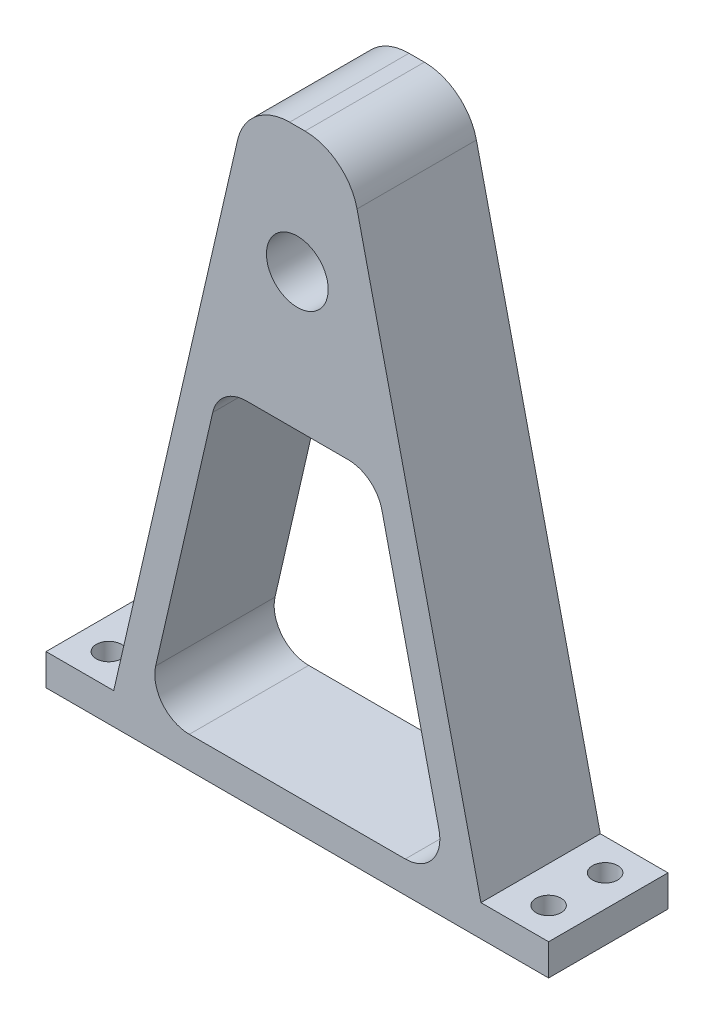
ISO-10303-21;
HEADER;
FILE_DESCRIPTION(('STEP AP214'),'2;1');
FILE_NAME('part.step','',(''),(''),'','','');
FILE_SCHEMA(('AUTOMOTIVE_DESIGN { 1 0 10303 214 1 1 1 1 }'));
ENDSEC;
DATA;
#1=APPLICATION_CONTEXT('core data for automotive mechanical design processes');
#2=APPLICATION_PROTOCOL_DEFINITION('international standard','automotive_design',2000,#1);
#3=PRODUCT_CONTEXT('',#1,'mechanical');
#4=PRODUCT('Part','Part','',(#3));
#5=PRODUCT_RELATED_PRODUCT_CATEGORY('part','',(#4));
#6=PRODUCT_DEFINITION_FORMATION('','',#4);
#7=PRODUCT_DEFINITION_CONTEXT('part definition',#1,'design');
#8=PRODUCT_DEFINITION('design','',#6,#7);
#9=PRODUCT_DEFINITION_SHAPE('','',#8);
#10=(LENGTH_UNIT() NAMED_UNIT(*) SI_UNIT(.MILLI.,.METRE.));
#11=(NAMED_UNIT(*) PLANE_ANGLE_UNIT() SI_UNIT($,.RADIAN.));
#12=(NAMED_UNIT(*) SI_UNIT($,.STERADIAN.) SOLID_ANGLE_UNIT());
#13=UNCERTAINTY_MEASURE_WITH_UNIT(LENGTH_MEASURE(1.E-05),#10,'distance_accuracy_value','');
#14=(GEOMETRIC_REPRESENTATION_CONTEXT(3) GLOBAL_UNCERTAINTY_ASSIGNED_CONTEXT((#13)) GLOBAL_UNIT_ASSIGNED_CONTEXT((#10,
#11,#12)) REPRESENTATION_CONTEXT('',''));
#15=CARTESIAN_POINT('',(0.,0.,0.));
#16=DIRECTION('',(0.,0.,1.));
#17=DIRECTION('',(1.,0.,0.));
#18=AXIS2_PLACEMENT_3D('',#15,#16,#17);
#19=CARTESIAN_POINT('',(0.,0.,-7.));
#20=DIRECTION('',(0.,0.,1.));
#21=DIRECTION('',(1.,0.,0.));
#22=AXIS2_PLACEMENT_3D('',#19,#20,#21);
#23=PLANE('',#22);
#24=DIRECTION('',(-0.224062946507409,-0.974574674410544,0.));
#25=VECTOR('',#24,1.);
#26=CARTESIAN_POINT('',(-17.9334567496,4.12305312859572,-7.));
#27=LINE('',#26,#25);
#28=CARTESIAN_POINT('',(-9.50819876408622,40.7691973753215,-7.));
#29=VERTEX_POINT('',#28);
#30=CARTESIAN_POINT('',(-29.2272614363371,-45.,-7.));
#31=VERTEX_POINT('',#30);
#32=EDGE_CURVE('E225',#29,#31,#27,.T.);
#33=ORIENTED_EDGE('',*,*,#32,.F.);
#34=CARTESIAN_POINT('',(-1.2243140315966,38.8646623300085,-7.));
#35=DIRECTION('',(0.,0.,1.));
#36=DIRECTION('',(1.,0.,0.));
#37=AXIS2_PLACEMENT_3D('',#34,#35,#36);
#38=CIRCLE('',#37,8.5);
#39=CARTESIAN_POINT('',(-1.2243140315966,47.3646623300085,-7.));
#40=VERTEX_POINT('',#39);
#41=EDGE_CURVE('E244',#29,#40,#38,.F.);
#42=ORIENTED_EDGE('',*,*,#41,.T.);
#43=DIRECTION('',(1.,0.,0.));
#44=VECTOR('',#43,1.);
#45=CARTESIAN_POINT('',(0.,47.3646623300085,-7.));
#46=LINE('',#45,#44);
#47=CARTESIAN_POINT('',(1.22431403159659,47.3646623300085,-7.));
#48=VERTEX_POINT('',#47);
#49=EDGE_CURVE('E222',#40,#48,#46,.T.);
#50=ORIENTED_EDGE('',*,*,#49,.T.);
#51=CARTESIAN_POINT('',(1.22431403159659,38.8646623300085,-7.));
#52=DIRECTION('',(0.,0.,1.));
#53=DIRECTION('',(1.,0.,0.));
#54=AXIS2_PLACEMENT_3D('',#51,#52,#53);
#55=CIRCLE('',#54,8.5);
#56=CARTESIAN_POINT('',(9.50819876408622,40.7691973753215,-7.));
#57=VERTEX_POINT('',#56);
#58=EDGE_CURVE('E242',#48,#57,#55,.F.);
#59=ORIENTED_EDGE('',*,*,#58,.T.);
#60=DIRECTION('',(0.224062946507409,-0.974574674410544,0.));
#61=VECTOR('',#60,1.);
#62=CARTESIAN_POINT('',(17.9334567496,4.12305312859572,-7.));
#63=LINE('',#62,#61);
#64=CARTESIAN_POINT('',(29.2272614363371,-45.,-7.));
#65=VERTEX_POINT('',#64);
#66=EDGE_CURVE('E220',#57,#65,#63,.T.);
#67=ORIENTED_EDGE('',*,*,#66,.T.);
#68=DIRECTION('',(1.,0.,0.));
#69=VECTOR('',#68,1.);
#70=CARTESIAN_POINT('',(0.,-45.,-7.));
#71=LINE('',#70,#69);
#72=CARTESIAN_POINT('',(40.,-45.,-7.));
#73=VERTEX_POINT('',#72);
#74=EDGE_CURVE('E180',#65,#73,#71,.T.);
#75=ORIENTED_EDGE('',*,*,#74,.T.);
#76=DIRECTION('',(0.,-1.,0.));
#77=VECTOR('',#76,1.);
#78=CARTESIAN_POINT('',(40.,0.,-7.));
#79=LINE('',#78,#77);
#80=CARTESIAN_POINT('',(40.,-50.,-7.));
#81=VERTEX_POINT('',#80);
#82=EDGE_CURVE('E188',#73,#81,#79,.T.);
#83=ORIENTED_EDGE('',*,*,#82,.T.);
#84=DIRECTION('',(1.,0.,0.));
#85=VECTOR('',#84,1.);
#86=CARTESIAN_POINT('',(0.,-50.,-7.));
#87=LINE('',#86,#85);
#88=CARTESIAN_POINT('',(-40.,-50.,-7.));
#89=VERTEX_POINT('',#88);
#90=EDGE_CURVE('E186',#89,#81,#87,.T.);
#91=ORIENTED_EDGE('',*,*,#90,.F.);
#92=DIRECTION('',(0.,-1.,0.));
#93=VECTOR('',#92,1.);
#94=CARTESIAN_POINT('',(-40.,0.,-7.));
#95=LINE('',#94,#93);
#96=CARTESIAN_POINT('',(-40.,-45.,-7.));
#97=VERTEX_POINT('',#96);
#98=EDGE_CURVE('E164',#97,#89,#95,.T.);
#99=ORIENTED_EDGE('',*,*,#98,.F.);
#100=EDGE_CURVE('E174',#97,#31,#71,.T.);
#101=ORIENTED_EDGE('',*,*,#100,.T.);
#102=EDGE_LOOP('',(#33,#42,#50,#59,#67,#75,#83,#91,#99,#101));
#103=FACE_BOUND('',#102,.T.);
#104=CARTESIAN_POINT('',(0.,27.3646623300085,-7.));
#105=DIRECTION('',(0.,0.,1.));
#106=DIRECTION('',(1.,0.,0.));
#107=AXIS2_PLACEMENT_3D('',#104,#105,#106);
#108=CIRCLE('',#107,4.915);
#109=CARTESIAN_POINT('',(4.915,27.3646623300085,-7.));
#110=VERTEX_POINT('',#109);
#111=EDGE_CURVE('E217',#110,#110,#108,.T.);
#112=ORIENTED_EDGE('',*,*,#111,.T.);
#113=EDGE_LOOP('',(#112));
#114=FACE_BOUND('',#113,.T.);
#115=DIRECTION('',(0.224062946507409,0.974574674410544,0.));
#116=VECTOR('',#115,1.);
#117=CARTESIAN_POINT('',(-12.4865717903461,5.49943481295583,-7.));
#118=LINE('',#117,#116);
#119=CARTESIAN_POINT('',(-22.5489950103047,-38.2676537942093,-7.));
#120=VERTEX_POINT('',#119);
#121=CARTESIAN_POINT('',(-13.4677414317411,1.23178101874657,-7.));
#122=VERTEX_POINT('',#121);
#123=EDGE_CURVE('E471',#120,#122,#118,.T.);
#124=ORIENTED_EDGE('',*,*,#123,.F.);
#125=CARTESIAN_POINT('',(-17.1888343010467,-39.5,-7.));
#126=DIRECTION('',(0.,0.,1.));
#127=DIRECTION('',(1.,0.,0.));
#128=AXIS2_PLACEMENT_3D('',#125,#126,#127);
#129=CIRCLE('',#128,5.5);
#130=CARTESIAN_POINT('',(-17.1888343010467,-45.,-7.));
#131=VERTEX_POINT('',#130);
#132=EDGE_CURVE('E272',#120,#131,#129,.T.);
#133=ORIENTED_EDGE('',*,*,#132,.T.);
#134=DIRECTION('',(-1.,0.,0.));
#135=VECTOR('',#134,1.);
#136=CARTESIAN_POINT('',(-24.0968182478517,-45.,-7.));
#137=LINE('',#136,#135);
#138=CARTESIAN_POINT('',(17.1888343010467,-45.,-7.));
#139=VERTEX_POINT('',#138);
#140=EDGE_CURVE('E358',#139,#131,#137,.T.);
#141=ORIENTED_EDGE('',*,*,#140,.F.);
#142=CARTESIAN_POINT('',(17.1888343010467,-39.5,-7.));
#143=DIRECTION('',(0.,0.,1.));
#144=DIRECTION('',(1.,0.,0.));
#145=AXIS2_PLACEMENT_3D('',#142,#143,#144);
#146=CIRCLE('',#145,5.5);
#147=CARTESIAN_POINT('',(22.5489950103047,-38.2676537942093,-7.));
#148=VERTEX_POINT('',#147);
#149=EDGE_CURVE('E268',#139,#148,#146,.T.);
#150=ORIENTED_EDGE('',*,*,#149,.T.);
#151=DIRECTION('',(0.224062946507409,-0.974574674410544,0.));
#152=VECTOR('',#151,1.);
#153=CARTESIAN_POINT('',(12.4865717903461,5.49943481295583,-7.));
#154=LINE('',#153,#152);
#155=CARTESIAN_POINT('',(13.4677414317411,1.23178101874657,-7.));
#156=VERTEX_POINT('',#155);
#157=EDGE_CURVE('E476',#156,#148,#154,.T.);
#158=ORIENTED_EDGE('',*,*,#157,.F.);
#159=CARTESIAN_POINT('',(8.1075807224831,-0.000565187044171932,-7.));
#160=DIRECTION('',(0.,0.,1.));
#161=DIRECTION('',(1.,0.,0.));
#162=AXIS2_PLACEMENT_3D('',#159,#160,#161);
#163=CIRCLE('',#162,5.5);
#164=CARTESIAN_POINT('',(8.1075807224831,5.49943481295583,-7.));
#165=VERTEX_POINT('',#164);
#166=EDGE_CURVE('E42',#156,#165,#163,.T.);
#167=ORIENTED_EDGE('',*,*,#166,.T.);
#168=DIRECTION('',(1.,0.,0.));
#169=VECTOR('',#168,1.);
#170=CARTESIAN_POINT('',(-12.4865717903461,5.49943481295583,-7.));
#171=LINE('',#170,#169);
#172=CARTESIAN_POINT('',(-8.1075807224831,5.49943481295583,-7.));
#173=VERTEX_POINT('',#172);
#174=EDGE_CURVE('E472',#173,#165,#171,.T.);
#175=ORIENTED_EDGE('',*,*,#174,.F.);
#176=CARTESIAN_POINT('',(-8.1075807224831,-0.000565187044171932,-7.));
#177=DIRECTION('',(0.,0.,1.));
#178=DIRECTION('',(1.,0.,0.));
#179=AXIS2_PLACEMENT_3D('',#176,#177,#178);
#180=CIRCLE('',#179,5.5);
#181=EDGE_CURVE('E56',#173,#122,#180,.T.);
#182=ORIENTED_EDGE('',*,*,#181,.T.);
#183=EDGE_LOOP('',(#124,#133,#141,#150,#158,#167,#175,#182));
#184=FACE_BOUND('',#183,.T.);
#185=ADVANCED_FACE('F34',(#103,#114,#184),#23,.F.);
#186=CARTESIAN_POINT('',(0.,0.,12.));
#187=DIRECTION('',(0.,0.,1.));
#188=DIRECTION('',(1.,0.,0.));
#189=AXIS2_PLACEMENT_3D('',#186,#187,#188);
#190=PLANE('',#189);
#191=CARTESIAN_POINT('',(0.,27.3646623300085,12.));
#192=DIRECTION('',(0.,0.,1.));
#193=DIRECTION('',(1.,0.,0.));
#194=AXIS2_PLACEMENT_3D('',#191,#192,#193);
#195=CIRCLE('',#194,4.915);
#196=CARTESIAN_POINT('',(4.915,27.3646623300085,12.));
#197=VERTEX_POINT('',#196);
#198=EDGE_CURVE('E169',#197,#197,#195,.T.);
#199=ORIENTED_EDGE('',*,*,#198,.F.);
#200=EDGE_LOOP('',(#199));
#201=FACE_BOUND('',#200,.T.);
#202=DIRECTION('',(1.,0.,0.));
#203=VECTOR('',#202,1.);
#204=CARTESIAN_POINT('',(0.,47.3646623300085,12.));
#205=LINE('',#204,#203);
#206=CARTESIAN_POINT('',(-1.2243140315966,47.3646623300085,12.));
#207=VERTEX_POINT('',#206);
#208=CARTESIAN_POINT('',(1.22431403159659,47.3646623300085,12.));
#209=VERTEX_POINT('',#208);
#210=EDGE_CURVE('E212',#207,#209,#205,.T.);
#211=ORIENTED_EDGE('',*,*,#210,.F.);
#212=CARTESIAN_POINT('',(-1.2243140315966,38.8646623300085,12.));
#213=DIRECTION('',(0.,0.,1.));
#214=DIRECTION('',(1.,0.,0.));
#215=AXIS2_PLACEMENT_3D('',#212,#213,#214);
#216=CIRCLE('',#215,8.5);
#217=CARTESIAN_POINT('',(-9.50819876408622,40.7691973753215,12.));
#218=VERTEX_POINT('',#217);
#219=EDGE_CURVE('E238',#207,#218,#216,.T.);
#220=ORIENTED_EDGE('',*,*,#219,.T.);
#221=DIRECTION('',(-0.224062946507409,-0.974574674410544,0.));
#222=VECTOR('',#221,1.);
#223=CARTESIAN_POINT('',(-17.9334567496,4.12305312859572,12.));
#224=LINE('',#223,#222);
#225=CARTESIAN_POINT('',(-29.2272614363371,-45.,12.));
#226=VERTEX_POINT('',#225);
#227=EDGE_CURVE('E215',#218,#226,#224,.T.);
#228=ORIENTED_EDGE('',*,*,#227,.T.);
#229=DIRECTION('',(1.,0.,0.));
#230=VECTOR('',#229,1.);
#231=CARTESIAN_POINT('',(0.,-45.,12.));
#232=LINE('',#231,#230);
#233=CARTESIAN_POINT('',(-40.,-45.,12.));
#234=VERTEX_POINT('',#233);
#235=EDGE_CURVE('E194',#234,#226,#232,.T.);
#236=ORIENTED_EDGE('',*,*,#235,.F.);
#237=DIRECTION('',(0.,-1.,0.));
#238=VECTOR('',#237,1.);
#239=CARTESIAN_POINT('',(-40.,0.,12.));
#240=LINE('',#239,#238);
#241=CARTESIAN_POINT('',(-40.,-50.,12.));
#242=VERTEX_POINT('',#241);
#243=EDGE_CURVE('E165',#234,#242,#240,.T.);
#244=ORIENTED_EDGE('',*,*,#243,.T.);
#245=DIRECTION('',(1.,0.,0.));
#246=VECTOR('',#245,1.);
#247=CARTESIAN_POINT('',(0.,-50.,12.));
#248=LINE('',#247,#246);
#249=CARTESIAN_POINT('',(40.,-50.,12.));
#250=VERTEX_POINT('',#249);
#251=EDGE_CURVE('E197',#242,#250,#248,.T.);
#252=ORIENTED_EDGE('',*,*,#251,.T.);
#253=DIRECTION('',(0.,-1.,0.));
#254=VECTOR('',#253,1.);
#255=CARTESIAN_POINT('',(40.,0.,12.));
#256=LINE('',#255,#254);
#257=CARTESIAN_POINT('',(40.,-45.,12.));
#258=VERTEX_POINT('',#257);
#259=EDGE_CURVE('E199',#258,#250,#256,.T.);
#260=ORIENTED_EDGE('',*,*,#259,.F.);
#261=CARTESIAN_POINT('',(29.2272614363371,-45.,12.));
#262=VERTEX_POINT('',#261);
#263=EDGE_CURVE('E193',#262,#258,#232,.T.);
#264=ORIENTED_EDGE('',*,*,#263,.F.);
#265=DIRECTION('',(0.224062946507409,-0.974574674410544,0.));
#266=VECTOR('',#265,1.);
#267=CARTESIAN_POINT('',(17.9334567496,4.12305312859572,12.));
#268=LINE('',#267,#266);
#269=CARTESIAN_POINT('',(9.50819876408622,40.7691973753215,12.));
#270=VERTEX_POINT('',#269);
#271=EDGE_CURVE('E210',#270,#262,#268,.T.);
#272=ORIENTED_EDGE('',*,*,#271,.F.);
#273=CARTESIAN_POINT('',(1.22431403159659,38.8646623300085,12.));
#274=DIRECTION('',(0.,0.,1.));
#275=DIRECTION('',(1.,0.,0.));
#276=AXIS2_PLACEMENT_3D('',#273,#274,#275);
#277=CIRCLE('',#276,8.5);
#278=EDGE_CURVE('E236',#270,#209,#277,.T.);
#279=ORIENTED_EDGE('',*,*,#278,.T.);
#280=EDGE_LOOP('',(#211,#220,#228,#236,#244,#252,#260,#264,#272,#279));
#281=FACE_BOUND('',#280,.T.);
#282=DIRECTION('',(1.,0.,0.));
#283=VECTOR('',#282,1.);
#284=CARTESIAN_POINT('',(-24.0968182478517,-45.,12.));
#285=LINE('',#284,#283);
#286=CARTESIAN_POINT('',(-17.1888343010467,-45.,12.));
#287=VERTEX_POINT('',#286);
#288=CARTESIAN_POINT('',(17.1888343010467,-45.,12.));
#289=VERTEX_POINT('',#288);
#290=EDGE_CURVE('E347',#287,#289,#285,.T.);
#291=ORIENTED_EDGE('',*,*,#290,.F.);
#292=CARTESIAN_POINT('',(-17.1888343010467,-39.5,12.));
#293=DIRECTION('',(0.,0.,1.));
#294=DIRECTION('',(1.,0.,0.));
#295=AXIS2_PLACEMENT_3D('',#292,#293,#294);
#296=CIRCLE('',#295,5.5);
#297=CARTESIAN_POINT('',(-22.5489950103047,-38.2676537942093,12.));
#298=VERTEX_POINT('',#297);
#299=EDGE_CURVE('E274',#287,#298,#296,.F.);
#300=ORIENTED_EDGE('',*,*,#299,.T.);
#301=DIRECTION('',(-0.224062946507409,-0.974574674410544,0.));
#302=VECTOR('',#301,1.);
#303=CARTESIAN_POINT('',(-12.4865717903461,5.49943481295583,12.));
#304=LINE('',#303,#302);
#305=CARTESIAN_POINT('',(-13.4677414317411,1.23178101874657,12.));
#306=VERTEX_POINT('',#305);
#307=EDGE_CURVE('E288',#306,#298,#304,.T.);
#308=ORIENTED_EDGE('',*,*,#307,.F.);
#309=CARTESIAN_POINT('',(-8.1075807224831,-0.000565187044171932,12.));
#310=DIRECTION('',(0.,0.,1.));
#311=DIRECTION('',(1.,0.,0.));
#312=AXIS2_PLACEMENT_3D('',#309,#310,#311);
#313=CIRCLE('',#312,5.5);
#314=CARTESIAN_POINT('',(-8.1075807224831,5.49943481295583,12.));
#315=VERTEX_POINT('',#314);
#316=EDGE_CURVE('E277',#306,#315,#313,.F.);
#317=ORIENTED_EDGE('',*,*,#316,.T.);
#318=DIRECTION('',(-1.,0.,0.));
#319=VECTOR('',#318,1.);
#320=CARTESIAN_POINT('',(-12.4865717903461,5.49943481295583,12.));
#321=LINE('',#320,#319);
#322=CARTESIAN_POINT('',(8.1075807224831,5.49943481295583,12.));
#323=VERTEX_POINT('',#322);
#324=EDGE_CURVE('E285',#323,#315,#321,.T.);
#325=ORIENTED_EDGE('',*,*,#324,.F.);
#326=CARTESIAN_POINT('',(8.1075807224831,-0.000565187044171932,12.));
#327=DIRECTION('',(0.,0.,1.));
#328=DIRECTION('',(1.,0.,0.));
#329=AXIS2_PLACEMENT_3D('',#326,#327,#328);
#330=CIRCLE('',#329,5.5);
#331=CARTESIAN_POINT('',(13.4677414317411,1.23178101874657,12.));
#332=VERTEX_POINT('',#331);
#333=EDGE_CURVE('E11',#323,#332,#330,.F.);
#334=ORIENTED_EDGE('',*,*,#333,.T.);
#335=DIRECTION('',(-0.224062946507409,0.974574674410544,0.));
#336=VECTOR('',#335,1.);
#337=CARTESIAN_POINT('',(12.4865717903461,5.49943481295583,12.));
#338=LINE('',#337,#336);
#339=CARTESIAN_POINT('',(22.5489950103047,-38.2676537942093,12.));
#340=VERTEX_POINT('',#339);
#341=EDGE_CURVE('E350',#340,#332,#338,.T.);
#342=ORIENTED_EDGE('',*,*,#341,.F.);
#343=CARTESIAN_POINT('',(17.1888343010467,-39.5,12.));
#344=DIRECTION('',(0.,0.,1.));
#345=DIRECTION('',(1.,0.,0.));
#346=AXIS2_PLACEMENT_3D('',#343,#344,#345);
#347=CIRCLE('',#346,5.5);
#348=EDGE_CURVE('E270',#340,#289,#347,.F.);
#349=ORIENTED_EDGE('',*,*,#348,.T.);
#350=EDGE_LOOP('',(#291,#300,#308,#317,#325,#334,#342,#349));
#351=FACE_BOUND('',#350,.T.);
#352=ADVANCED_FACE('F284',(#201,#281,#351),#190,.T.);
#353=CARTESIAN_POINT('',(17.9334567496,4.12305312859572,-7.));
#354=DIRECTION('',(-0.974574674410544,-0.224062946507409,0.));
#355=DIRECTION('',(0.224062946507409,-0.974574674410544,0.));
#356=AXIS2_PLACEMENT_3D('',#353,#354,#355);
#357=PLANE('',#356);
#358=ORIENTED_EDGE('',*,*,#66,.F.);
#359=DIRECTION('',(0.,0.,1.));
#360=VECTOR('',#359,1.);
#361=CARTESIAN_POINT('',(9.50819876408622,40.7691973753215,-7.));
#362=LINE('',#361,#360);
#363=EDGE_CURVE('E246',#57,#270,#362,.T.);
#364=ORIENTED_EDGE('',*,*,#363,.T.);
#365=ORIENTED_EDGE('',*,*,#271,.T.);
#366=DIRECTION('',(0.,0.,1.));
#367=VECTOR('',#366,1.);
#368=CARTESIAN_POINT('',(29.2272614363371,-45.,-7.));
#369=LINE('',#368,#367);
#370=EDGE_CURVE('E227',#65,#262,#369,.T.);
#371=ORIENTED_EDGE('',*,*,#370,.F.);
#372=EDGE_LOOP('',(#358,#364,#365,#371));
#373=FACE_BOUND('',#372,.T.);
#374=ADVANCED_FACE('F310',(#373),#357,.F.);
#375=CARTESIAN_POINT('',(-17.9334567496,4.12305312859572,-7.));
#376=DIRECTION('',(-0.974574674410544,0.224062946507409,0.));
#377=DIRECTION('',(-0.224062946507409,-0.974574674410544,0.));
#378=AXIS2_PLACEMENT_3D('',#375,#376,#377);
#379=PLANE('',#378);
#380=ORIENTED_EDGE('',*,*,#227,.F.);
#381=DIRECTION('',(0.,0.,1.));
#382=VECTOR('',#381,1.);
#383=CARTESIAN_POINT('',(-9.50819876408622,40.7691973753215,-7.));
#384=LINE('',#383,#382);
#385=EDGE_CURVE('E240',#218,#29,#384,.F.);
#386=ORIENTED_EDGE('',*,*,#385,.T.);
#387=ORIENTED_EDGE('',*,*,#32,.T.);
#388=DIRECTION('',(0.,0.,1.));
#389=VECTOR('',#388,1.);
#390=CARTESIAN_POINT('',(-29.2272614363371,-45.,-7.));
#391=LINE('',#390,#389);
#392=EDGE_CURVE('E177',#31,#226,#391,.T.);
#393=ORIENTED_EDGE('',*,*,#392,.T.);
#394=EDGE_LOOP('',(#380,#386,#387,#393));
#395=FACE_BOUND('',#394,.T.);
#396=ADVANCED_FACE('F315',(#395),#379,.T.);
#397=CARTESIAN_POINT('',(0.,27.3646623300085,-7.));
#398=DIRECTION('',(0.,0.,1.));
#399=DIRECTION('',(1.,0.,0.));
#400=AXIS2_PLACEMENT_3D('',#397,#398,#399);
#401=CYLINDRICAL_SURFACE('',#400,4.915);
#402=ORIENTED_EDGE('',*,*,#111,.F.);
#403=EDGE_LOOP('',(#402));
#404=FACE_BOUND('',#403,.T.);
#405=ORIENTED_EDGE('',*,*,#198,.T.);
#406=EDGE_LOOP('',(#405));
#407=FACE_BOUND('',#406,.T.);
#408=ADVANCED_FACE('F318',(#404,#407),#401,.F.);
#409=CARTESIAN_POINT('',(0.,47.3646623300085,-7.));
#410=DIRECTION('',(0.,-1.,0.));
#411=DIRECTION('',(0.,0.,-1.));
#412=AXIS2_PLACEMENT_3D('',#409,#410,#411);
#413=PLANE('',#412);
#414=ORIENTED_EDGE('',*,*,#49,.F.);
#415=DIRECTION('',(0.,0.,1.));
#416=VECTOR('',#415,1.);
#417=CARTESIAN_POINT('',(-1.2243140315966,47.3646623300085,12.));
#418=LINE('',#417,#416);
#419=EDGE_CURVE('E233',#40,#207,#418,.T.);
#420=ORIENTED_EDGE('',*,*,#419,.T.);
#421=ORIENTED_EDGE('',*,*,#210,.T.);
#422=DIRECTION('',(0.,0.,1.));
#423=VECTOR('',#422,1.);
#424=CARTESIAN_POINT('',(1.22431403159659,47.3646623300085,-7.));
#425=LINE('',#424,#423);
#426=EDGE_CURVE('E230',#209,#48,#425,.F.);
#427=ORIENTED_EDGE('',*,*,#426,.T.);
#428=EDGE_LOOP('',(#414,#420,#421,#427));
#429=FACE_BOUND('',#428,.T.);
#430=ADVANCED_FACE('F320',(#429),#413,.F.);
#431=CARTESIAN_POINT('',(0.,-45.,12.));
#432=DIRECTION('',(0.,1.,0.));
#433=DIRECTION('',(0.,0.,1.));
#434=AXIS2_PLACEMENT_3D('',#431,#432,#433);
#435=PLANE('',#434);
#436=CARTESIAN_POINT('',(-35.,-45.,7.));
#437=DIRECTION('',(0.,1.,0.));
#438=DIRECTION('',(0.,0.,1.));
#439=AXIS2_PLACEMENT_3D('',#436,#437,#438);
#440=CIRCLE('',#439,2.);
#441=CARTESIAN_POINT('',(-35.,-45.,9.));
#442=VERTEX_POINT('',#441);
#443=EDGE_CURVE('E368',#442,#442,#440,.T.);
#444=ORIENTED_EDGE('',*,*,#443,.F.);
#445=EDGE_LOOP('',(#444));
#446=FACE_BOUND('',#445,.T.);
#447=CARTESIAN_POINT('',(-35.,-45.,-2.));
#448=DIRECTION('',(0.,1.,0.));
#449=DIRECTION('',(0.,0.,1.));
#450=AXIS2_PLACEMENT_3D('',#447,#448,#449);
#451=CIRCLE('',#450,2.);
#452=CARTESIAN_POINT('',(-35.,-45.,0.));
#453=VERTEX_POINT('',#452);
#454=EDGE_CURVE('E375',#453,#453,#451,.T.);
#455=ORIENTED_EDGE('',*,*,#454,.F.);
#456=EDGE_LOOP('',(#455));
#457=FACE_BOUND('',#456,.T.);
#458=ORIENTED_EDGE('',*,*,#392,.F.);
#459=ORIENTED_EDGE('',*,*,#100,.F.);
#460=DIRECTION('',(0.,0.,-1.));
#461=VECTOR('',#460,1.);
#462=CARTESIAN_POINT('',(-40.,-45.,12.));
#463=LINE('',#462,#461);
#464=EDGE_CURVE('E159',#234,#97,#463,.T.);
#465=ORIENTED_EDGE('',*,*,#464,.F.);
#466=ORIENTED_EDGE('',*,*,#235,.T.);
#467=EDGE_LOOP('',(#458,#459,#465,#466));
#468=FACE_BOUND('',#467,.T.);
#469=ADVANCED_FACE('F175',(#446,#457,#468),#435,.T.);
#470=CARTESIAN_POINT('',(35.,-45.,-2.));
#471=DIRECTION('',(0.,1.,0.));
#472=DIRECTION('',(0.,0.,1.));
#473=AXIS2_PLACEMENT_3D('',#470,#471,#472);
#474=CIRCLE('',#473,2.);
#475=CARTESIAN_POINT('',(35.,-45.,0.));
#476=VERTEX_POINT('',#475);
#477=EDGE_CURVE('E367',#476,#476,#474,.T.);
#478=ORIENTED_EDGE('',*,*,#477,.F.);
#479=EDGE_LOOP('',(#478));
#480=FACE_BOUND('',#479,.T.);
#481=CARTESIAN_POINT('',(35.,-45.,7.));
#482=DIRECTION('',(0.,1.,0.));
#483=DIRECTION('',(0.,0.,1.));
#484=AXIS2_PLACEMENT_3D('',#481,#482,#483);
#485=CIRCLE('',#484,2.);
#486=CARTESIAN_POINT('',(35.,-45.,9.));
#487=VERTEX_POINT('',#486);
#488=EDGE_CURVE('E292',#487,#487,#485,.T.);
#489=ORIENTED_EDGE('',*,*,#488,.F.);
#490=EDGE_LOOP('',(#489));
#491=FACE_BOUND('',#490,.T.);
#492=ORIENTED_EDGE('',*,*,#74,.F.);
#493=ORIENTED_EDGE('',*,*,#370,.T.);
#494=ORIENTED_EDGE('',*,*,#263,.T.);
#495=DIRECTION('',(0.,0.,-1.));
#496=VECTOR('',#495,1.);
#497=CARTESIAN_POINT('',(40.,-45.,12.));
#498=LINE('',#497,#496);
#499=EDGE_CURVE('E202',#258,#73,#498,.T.);
#500=ORIENTED_EDGE('',*,*,#499,.T.);
#501=EDGE_LOOP('',(#492,#493,#494,#500));
#502=FACE_BOUND('',#501,.T.);
#503=ADVANCED_FACE('F391',(#480,#491,#502),#435,.T.);
#504=CARTESIAN_POINT('',(-40.,0.,12.));
#505=DIRECTION('',(1.,0.,0.));
#506=DIRECTION('',(0.,0.,-1.));
#507=AXIS2_PLACEMENT_3D('',#504,#505,#506);
#508=PLANE('',#507);
#509=ORIENTED_EDGE('',*,*,#464,.T.);
#510=ORIENTED_EDGE('',*,*,#98,.T.);
#511=DIRECTION('',(0.,0.,-1.));
#512=VECTOR('',#511,1.);
#513=CARTESIAN_POINT('',(-40.,-50.,12.));
#514=LINE('',#513,#512);
#515=EDGE_CURVE('E170',#242,#89,#514,.T.);
#516=ORIENTED_EDGE('',*,*,#515,.F.);
#517=ORIENTED_EDGE('',*,*,#243,.F.);
#518=EDGE_LOOP('',(#509,#510,#516,#517));
#519=FACE_BOUND('',#518,.T.);
#520=ADVANCED_FACE('F161',(#519),#508,.F.);
#521=CARTESIAN_POINT('',(0.,-50.,12.));
#522=DIRECTION('',(0.,1.,0.));
#523=DIRECTION('',(0.,0.,1.));
#524=AXIS2_PLACEMENT_3D('',#521,#522,#523);
#525=PLANE('',#524);
#526=CARTESIAN_POINT('',(-35.,-50.,7.));
#527=DIRECTION('',(0.,1.,0.));
#528=DIRECTION('',(0.,0.,1.));
#529=AXIS2_PLACEMENT_3D('',#526,#527,#528);
#530=CIRCLE('',#529,2.);
#531=CARTESIAN_POINT('',(-35.,-50.,9.));
#532=VERTEX_POINT('',#531);
#533=EDGE_CURVE('E371',#532,#532,#530,.F.);
#534=ORIENTED_EDGE('',*,*,#533,.F.);
#535=EDGE_LOOP('',(#534));
#536=FACE_BOUND('',#535,.T.);
#537=CARTESIAN_POINT('',(35.,-50.,-2.));
#538=DIRECTION('',(0.,1.,0.));
#539=DIRECTION('',(0.,0.,1.));
#540=AXIS2_PLACEMENT_3D('',#537,#538,#539);
#541=CIRCLE('',#540,2.);
#542=CARTESIAN_POINT('',(35.,-50.,0.));
#543=VERTEX_POINT('',#542);
#544=EDGE_CURVE('E372',#543,#543,#541,.F.);
#545=ORIENTED_EDGE('',*,*,#544,.F.);
#546=EDGE_LOOP('',(#545));
#547=FACE_BOUND('',#546,.T.);
#548=CARTESIAN_POINT('',(35.,-50.,7.));
#549=DIRECTION('',(0.,1.,0.));
#550=DIRECTION('',(0.,0.,1.));
#551=AXIS2_PLACEMENT_3D('',#548,#549,#550);
#552=CIRCLE('',#551,2.);
#553=CARTESIAN_POINT('',(35.,-50.,9.));
#554=VERTEX_POINT('',#553);
#555=EDGE_CURVE('E364',#554,#554,#552,.F.);
#556=ORIENTED_EDGE('',*,*,#555,.F.);
#557=EDGE_LOOP('',(#556));
#558=FACE_BOUND('',#557,.T.);
#559=CARTESIAN_POINT('',(-35.,-50.,-2.));
#560=DIRECTION('',(0.,1.,0.));
#561=DIRECTION('',(0.,0.,1.));
#562=AXIS2_PLACEMENT_3D('',#559,#560,#561);
#563=CIRCLE('',#562,2.);
#564=CARTESIAN_POINT('',(-35.,-50.,0.));
#565=VERTEX_POINT('',#564);
#566=EDGE_CURVE('E381',#565,#565,#563,.F.);
#567=ORIENTED_EDGE('',*,*,#566,.F.);
#568=EDGE_LOOP('',(#567));
#569=FACE_BOUND('',#568,.T.);
#570=ORIENTED_EDGE('',*,*,#515,.T.);
#571=ORIENTED_EDGE('',*,*,#90,.T.);
#572=DIRECTION('',(0.,0.,-1.));
#573=VECTOR('',#572,1.);
#574=CARTESIAN_POINT('',(40.,-50.,12.));
#575=LINE('',#574,#573);
#576=EDGE_CURVE('E205',#250,#81,#575,.T.);
#577=ORIENTED_EDGE('',*,*,#576,.F.);
#578=ORIENTED_EDGE('',*,*,#251,.F.);
#579=EDGE_LOOP('',(#570,#571,#577,#578));
#580=FACE_BOUND('',#579,.T.);
#581=ADVANCED_FACE('F399',(#536,#547,#558,#569,#580),#525,.F.);
#582=CARTESIAN_POINT('',(40.,0.,12.));
#583=DIRECTION('',(1.,0.,0.));
#584=DIRECTION('',(0.,0.,-1.));
#585=AXIS2_PLACEMENT_3D('',#582,#583,#584);
#586=PLANE('',#585);
#587=ORIENTED_EDGE('',*,*,#576,.T.);
#588=ORIENTED_EDGE('',*,*,#82,.F.);
#589=ORIENTED_EDGE('',*,*,#499,.F.);
#590=ORIENTED_EDGE('',*,*,#259,.T.);
#591=EDGE_LOOP('',(#587,#588,#589,#590));
#592=FACE_BOUND('',#591,.T.);
#593=ADVANCED_FACE('F395',(#592),#586,.T.);
#594=CARTESIAN_POINT('',(-35.,-50.001,-2.));
#595=DIRECTION('',(0.,1.,0.));
#596=DIRECTION('',(0.,0.,1.));
#597=AXIS2_PLACEMENT_3D('',#594,#595,#596);
#598=CYLINDRICAL_SURFACE('',#597,2.);
#599=ORIENTED_EDGE('',*,*,#454,.T.);
#600=EDGE_LOOP('',(#599));
#601=FACE_BOUND('',#600,.T.);
#602=ORIENTED_EDGE('',*,*,#566,.T.);
#603=EDGE_LOOP('',(#602));
#604=FACE_BOUND('',#603,.T.);
#605=ADVANCED_FACE('F418',(#601,#604),#598,.F.);
#606=CARTESIAN_POINT('',(35.,-50.001,7.));
#607=DIRECTION('',(0.,1.,0.));
#608=DIRECTION('',(0.,0.,1.));
#609=AXIS2_PLACEMENT_3D('',#606,#607,#608);
#610=CYLINDRICAL_SURFACE('',#609,2.);
#611=ORIENTED_EDGE('',*,*,#488,.T.);
#612=EDGE_LOOP('',(#611));
#613=FACE_BOUND('',#612,.T.);
#614=ORIENTED_EDGE('',*,*,#555,.T.);
#615=EDGE_LOOP('',(#614));
#616=FACE_BOUND('',#615,.T.);
#617=ADVANCED_FACE('F434',(#613,#616),#610,.F.);
#618=CARTESIAN_POINT('',(35.,-50.001,-2.));
#619=DIRECTION('',(0.,1.,0.));
#620=DIRECTION('',(0.,0.,1.));
#621=AXIS2_PLACEMENT_3D('',#618,#619,#620);
#622=CYLINDRICAL_SURFACE('',#621,2.);
#623=ORIENTED_EDGE('',*,*,#477,.T.);
#624=EDGE_LOOP('',(#623));
#625=FACE_BOUND('',#624,.T.);
#626=ORIENTED_EDGE('',*,*,#544,.T.);
#627=EDGE_LOOP('',(#626));
#628=FACE_BOUND('',#627,.T.);
#629=ADVANCED_FACE('F437',(#625,#628),#622,.F.);
#630=CARTESIAN_POINT('',(-35.,-50.001,7.));
#631=DIRECTION('',(0.,1.,0.));
#632=DIRECTION('',(0.,0.,1.));
#633=AXIS2_PLACEMENT_3D('',#630,#631,#632);
#634=CYLINDRICAL_SURFACE('',#633,2.);
#635=ORIENTED_EDGE('',*,*,#443,.T.);
#636=EDGE_LOOP('',(#635));
#637=FACE_BOUND('',#636,.T.);
#638=ORIENTED_EDGE('',*,*,#533,.T.);
#639=EDGE_LOOP('',(#638));
#640=FACE_BOUND('',#639,.T.);
#641=ADVANCED_FACE('F446',(#637,#640),#634,.F.);
#642=CARTESIAN_POINT('',(-12.4865717903461,5.49943481295583,12.001));
#643=DIRECTION('',(0.974574674410544,-0.224062946507409,0.));
#644=DIRECTION('',(0.224062946507409,0.974574674410544,0.));
#645=AXIS2_PLACEMENT_3D('',#642,#643,#644);
#646=PLANE('',#645);
#647=ORIENTED_EDGE('',*,*,#307,.T.);
#648=DIRECTION('',(0.,0.,-1.));
#649=VECTOR('',#648,1.);
#650=CARTESIAN_POINT('',(-22.5489950103047,-38.2676537942093,-7.));
#651=LINE('',#650,#649);
#652=EDGE_CURVE('E261',#298,#120,#651,.T.);
#653=ORIENTED_EDGE('',*,*,#652,.T.);
#654=ORIENTED_EDGE('',*,*,#123,.T.);
#655=DIRECTION('',(0.,0.,-1.));
#656=VECTOR('',#655,1.);
#657=CARTESIAN_POINT('',(-13.4677414317411,1.23178101874658,12.));
#658=LINE('',#657,#656);
#659=EDGE_CURVE('E259',#122,#306,#658,.F.);
#660=ORIENTED_EDGE('',*,*,#659,.T.);
#661=EDGE_LOOP('',(#647,#653,#654,#660));
#662=FACE_BOUND('',#661,.T.);
#663=ADVANCED_FACE('F452',(#662),#646,.T.);
#664=CARTESIAN_POINT('',(-24.0968182478517,-45.,12.001));
#665=DIRECTION('',(0.,1.,0.));
#666=DIRECTION('',(0.,0.,1.));
#667=AXIS2_PLACEMENT_3D('',#664,#665,#666);
#668=PLANE('',#667);
#669=ORIENTED_EDGE('',*,*,#290,.T.);
#670=DIRECTION('',(0.,0.,-1.));
#671=VECTOR('',#670,1.);
#672=CARTESIAN_POINT('',(17.1888343010467,-45.,-7.));
#673=LINE('',#672,#671);
#674=EDGE_CURVE('E251',#289,#139,#673,.T.);
#675=ORIENTED_EDGE('',*,*,#674,.T.);
#676=ORIENTED_EDGE('',*,*,#140,.T.);
#677=DIRECTION('',(0.,0.,-1.));
#678=VECTOR('',#677,1.);
#679=CARTESIAN_POINT('',(-17.1888343010467,-45.,12.));
#680=LINE('',#679,#678);
#681=EDGE_CURVE('E249',#131,#287,#680,.F.);
#682=ORIENTED_EDGE('',*,*,#681,.T.);
#683=EDGE_LOOP('',(#669,#675,#676,#682));
#684=FACE_BOUND('',#683,.T.);
#685=ADVANCED_FACE('F352',(#684),#668,.T.);
#686=CARTESIAN_POINT('',(12.4865717903461,5.49943481295583,12.001));
#687=DIRECTION('',(-0.974574674410544,-0.224062946507409,0.));
#688=DIRECTION('',(0.224062946507409,-0.974574674410544,0.));
#689=AXIS2_PLACEMENT_3D('',#686,#687,#688);
#690=PLANE('',#689);
#691=ORIENTED_EDGE('',*,*,#157,.T.);
#692=DIRECTION('',(0.,0.,-1.));
#693=VECTOR('',#692,1.);
#694=CARTESIAN_POINT('',(22.5489950103047,-38.2676537942093,12.));
#695=LINE('',#694,#693);
#696=EDGE_CURVE('E257',#148,#340,#695,.F.);
#697=ORIENTED_EDGE('',*,*,#696,.T.);
#698=ORIENTED_EDGE('',*,*,#341,.T.);
#699=DIRECTION('',(0.,0.,-1.));
#700=VECTOR('',#699,1.);
#701=CARTESIAN_POINT('',(13.4677414317411,1.23178101874658,-7.));
#702=LINE('',#701,#700);
#703=EDGE_CURVE('E254',#332,#156,#702,.T.);
#704=ORIENTED_EDGE('',*,*,#703,.T.);
#705=EDGE_LOOP('',(#691,#697,#698,#704));
#706=FACE_BOUND('',#705,.T.);
#707=ADVANCED_FACE('F467',(#706),#690,.T.);
#708=CARTESIAN_POINT('',(-12.4865717903461,5.49943481295583,12.001));
#709=DIRECTION('',(0.,-1.,0.));
#710=DIRECTION('',(0.,0.,-1.));
#711=AXIS2_PLACEMENT_3D('',#708,#709,#710);
#712=PLANE('',#711);
#713=ORIENTED_EDGE('',*,*,#324,.T.);
#714=DIRECTION('',(0.,0.,-1.));
#715=VECTOR('',#714,1.);
#716=CARTESIAN_POINT('',(-8.1075807224831,5.49943481295583,-7.));
#717=LINE('',#716,#715);
#718=EDGE_CURVE('E266',#315,#173,#717,.T.);
#719=ORIENTED_EDGE('',*,*,#718,.T.);
#720=ORIENTED_EDGE('',*,*,#174,.T.);
#721=DIRECTION('',(0.,0.,-1.));
#722=VECTOR('',#721,1.);
#723=CARTESIAN_POINT('',(8.1075807224831,5.49943481295583,12.));
#724=LINE('',#723,#722);
#725=EDGE_CURVE('E264',#165,#323,#724,.F.);
#726=ORIENTED_EDGE('',*,*,#725,.T.);
#727=EDGE_LOOP('',(#713,#719,#720,#726));
#728=FACE_BOUND('',#727,.T.);
#729=ADVANCED_FACE('F290',(#728),#712,.T.);
#730=CARTESIAN_POINT('',(-1.2243140315966,38.8646623300085,-7.));
#731=DIRECTION('',(0.,0.,-1.));
#732=DIRECTION('',(-1.,0.,0.));
#733=AXIS2_PLACEMENT_3D('',#730,#731,#732);
#734=CYLINDRICAL_SURFACE('',#733,8.5);
#735=ORIENTED_EDGE('',*,*,#41,.F.);
#736=ORIENTED_EDGE('',*,*,#385,.F.);
#737=ORIENTED_EDGE('',*,*,#219,.F.);
#738=ORIENTED_EDGE('',*,*,#419,.F.);
#739=EDGE_LOOP('',(#735,#736,#737,#738));
#740=FACE_BOUND('',#739,.T.);
#741=ADVANCED_FACE('F330',(#740),#734,.T.);
#742=CARTESIAN_POINT('',(1.22431403159659,38.8646623300085,-7.));
#743=DIRECTION('',(0.,0.,1.));
#744=DIRECTION('',(1.,0.,0.));
#745=AXIS2_PLACEMENT_3D('',#742,#743,#744);
#746=CYLINDRICAL_SURFACE('',#745,8.5);
#747=ORIENTED_EDGE('',*,*,#58,.F.);
#748=ORIENTED_EDGE('',*,*,#426,.F.);
#749=ORIENTED_EDGE('',*,*,#278,.F.);
#750=ORIENTED_EDGE('',*,*,#363,.F.);
#751=EDGE_LOOP('',(#747,#748,#749,#750));
#752=FACE_BOUND('',#751,.T.);
#753=ADVANCED_FACE('F333',(#752),#746,.T.);
#754=CARTESIAN_POINT('',(17.1888343010467,-39.5,12.001));
#755=DIRECTION('',(0.,0.,1.));
#756=DIRECTION('',(1.,0.,0.));
#757=AXIS2_PLACEMENT_3D('',#754,#755,#756);
#758=CYLINDRICAL_SURFACE('',#757,5.5);
#759=ORIENTED_EDGE('',*,*,#348,.F.);
#760=ORIENTED_EDGE('',*,*,#696,.F.);
#761=ORIENTED_EDGE('',*,*,#149,.F.);
#762=ORIENTED_EDGE('',*,*,#674,.F.);
#763=EDGE_LOOP('',(#759,#760,#761,#762));
#764=FACE_BOUND('',#763,.T.);
#765=ADVANCED_FACE('F302',(#764),#758,.F.);
#766=CARTESIAN_POINT('',(-17.1888343010467,-39.5,12.001));
#767=DIRECTION('',(0.,0.,1.));
#768=DIRECTION('',(1.,0.,0.));
#769=AXIS2_PLACEMENT_3D('',#766,#767,#768);
#770=CYLINDRICAL_SURFACE('',#769,5.5);
#771=ORIENTED_EDGE('',*,*,#299,.F.);
#772=ORIENTED_EDGE('',*,*,#681,.F.);
#773=ORIENTED_EDGE('',*,*,#132,.F.);
#774=ORIENTED_EDGE('',*,*,#652,.F.);
#775=EDGE_LOOP('',(#771,#772,#773,#774));
#776=FACE_BOUND('',#775,.T.);
#777=ADVANCED_FACE('F296',(#776),#770,.F.);
#778=CARTESIAN_POINT('',(-8.1075807224831,-0.000565187044171932,12.001));
#779=DIRECTION('',(0.,0.,1.));
#780=DIRECTION('',(1.,0.,0.));
#781=AXIS2_PLACEMENT_3D('',#778,#779,#780);
#782=CYLINDRICAL_SURFACE('',#781,5.5);
#783=ORIENTED_EDGE('',*,*,#316,.F.);
#784=ORIENTED_EDGE('',*,*,#659,.F.);
#785=ORIENTED_EDGE('',*,*,#181,.F.);
#786=ORIENTED_EDGE('',*,*,#718,.F.);
#787=EDGE_LOOP('',(#783,#784,#785,#786));
#788=FACE_BOUND('',#787,.T.);
#789=ADVANCED_FACE('F294',(#788),#782,.F.);
#790=CARTESIAN_POINT('',(8.1075807224831,-0.000565187044171932,12.001));
#791=DIRECTION('',(0.,0.,1.));
#792=DIRECTION('',(1.,0.,0.));
#793=AXIS2_PLACEMENT_3D('',#790,#791,#792);
#794=CYLINDRICAL_SURFACE('',#793,5.5);
#795=ORIENTED_EDGE('',*,*,#333,.F.);
#796=ORIENTED_EDGE('',*,*,#725,.F.);
#797=ORIENTED_EDGE('',*,*,#166,.F.);
#798=ORIENTED_EDGE('',*,*,#703,.F.);
#799=EDGE_LOOP('',(#795,#796,#797,#798));
#800=FACE_BOUND('',#799,.T.);
#801=ADVANCED_FACE('F36',(#800),#794,.F.);
#802=CLOSED_SHELL('',(#185,#352,#374,#396,#408,#430,#469,#503,#520,#581,#593,#605,#617,#629,
#641,#663,#685,#707,#729,#741,#753,#765,#777,#789,#801));
#803=MANIFOLD_SOLID_BREP('B2',#802);
#804=ADVANCED_BREP_SHAPE_REPRESENTATION('',(#18,#803),#14);
#805=SHAPE_DEFINITION_REPRESENTATION(#9,#804);
ENDSEC;
END-ISO-10303-21;
